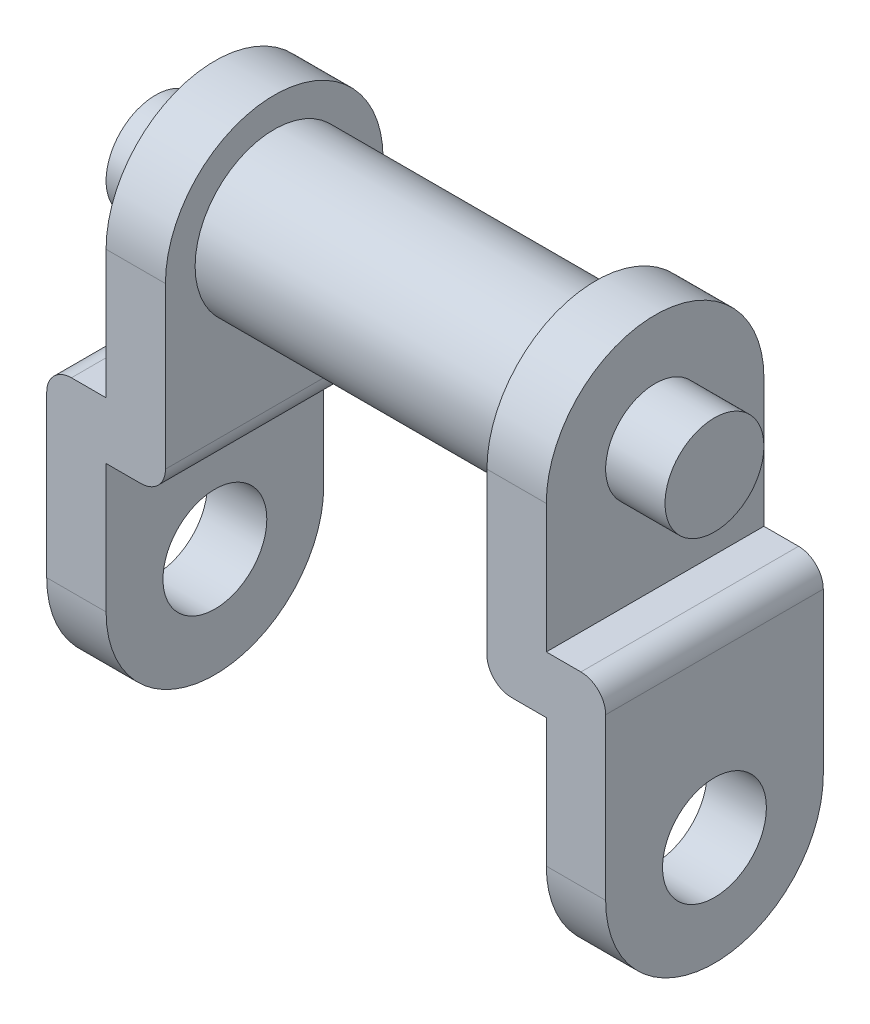
ISO-10303-21;
HEADER;
FILE_DESCRIPTION(('STEP AP214'),'2;1');
FILE_NAME('part.step','',(''),(''),'','','');
FILE_SCHEMA(('AUTOMOTIVE_DESIGN { 1 0 10303 214 1 1 1 1 }'));
ENDSEC;
DATA;
#1=APPLICATION_CONTEXT('core data for automotive mechanical design processes');
#2=APPLICATION_PROTOCOL_DEFINITION('international standard','automotive_design',2000,#1);
#3=PRODUCT_CONTEXT('',#1,'mechanical');
#4=PRODUCT('Part','Part','',(#3));
#5=PRODUCT_RELATED_PRODUCT_CATEGORY('part','',(#4));
#6=PRODUCT_DEFINITION_FORMATION('','',#4);
#7=PRODUCT_DEFINITION_CONTEXT('part definition',#1,'design');
#8=PRODUCT_DEFINITION('design','',#6,#7);
#9=PRODUCT_DEFINITION_SHAPE('','',#8);
#10=(LENGTH_UNIT() NAMED_UNIT(*) SI_UNIT(.MILLI.,.METRE.));
#11=(NAMED_UNIT(*) PLANE_ANGLE_UNIT() SI_UNIT($,.RADIAN.));
#12=(NAMED_UNIT(*) SI_UNIT($,.STERADIAN.) SOLID_ANGLE_UNIT());
#13=UNCERTAINTY_MEASURE_WITH_UNIT(LENGTH_MEASURE(1.E-05),#10,'distance_accuracy_value','');
#14=(GEOMETRIC_REPRESENTATION_CONTEXT(3) GLOBAL_UNCERTAINTY_ASSIGNED_CONTEXT((#13)) GLOBAL_UNIT_ASSIGNED_CONTEXT((#10,
#11,#12)) REPRESENTATION_CONTEXT('',''));
#15=CARTESIAN_POINT('',(0.,0.,0.));
#16=DIRECTION('',(0.,0.,1.));
#17=DIRECTION('',(1.,0.,0.));
#18=AXIS2_PLACEMENT_3D('',#15,#16,#17);
#19=CARTESIAN_POINT('',(4.45,-3.175,2.2));
#20=DIRECTION('',(0.,0.,1.));
#21=DIRECTION('',(1.,0.,0.));
#22=AXIS2_PLACEMENT_3D('',#19,#20,#21);
#23=PLANE('',#22);
#24=CARTESIAN_POINT('',(3.75,-3.25,2.2));
#25=DIRECTION('',(0.,0.,-1.));
#26=DIRECTION('',(-0.707106781186547,-0.707106781186548,0.));
#27=AXIS2_PLACEMENT_3D('',#24,#25,#26);
#28=CIRCLE('',#27,0.5);
#29=CARTESIAN_POINT('',(3.75,-3.75,2.2));
#30=VERTEX_POINT('',#29);
#31=CARTESIAN_POINT('',(3.25,-3.25,2.2));
#32=VERTEX_POINT('',#31);
#33=EDGE_CURVE('E274',#30,#32,#28,.T.);
#34=ORIENTED_EDGE('',*,*,#33,.F.);
#35=DIRECTION('',(1.,0.,0.));
#36=VECTOR('',#35,1.);
#37=CARTESIAN_POINT('',(3.75,-3.75,2.2));
#38=LINE('',#37,#36);
#39=CARTESIAN_POINT('',(4.45,-3.75,2.2));
#40=VERTEX_POINT('',#39);
#41=EDGE_CURVE('E272',#30,#40,#38,.T.);
#42=ORIENTED_EDGE('',*,*,#41,.T.);
#43=DIRECTION('',(0.,-1.,0.));
#44=VECTOR('',#43,1.);
#45=CARTESIAN_POINT('',(4.45,-3.75,2.2));
#46=LINE('',#45,#44);
#47=CARTESIAN_POINT('',(4.45,-6.35,2.2));
#48=VERTEX_POINT('',#47);
#49=EDGE_CURVE('E302',#40,#48,#46,.T.);
#50=ORIENTED_EDGE('',*,*,#49,.T.);
#51=DIRECTION('',(1.,0.,0.));
#52=VECTOR('',#51,1.);
#53=CARTESIAN_POINT('',(4.45,-6.35,2.2));
#54=LINE('',#53,#52);
#55=CARTESIAN_POINT('',(5.65,-6.35,2.2));
#56=VERTEX_POINT('',#55);
#57=EDGE_CURVE('E362',#48,#56,#54,.T.);
#58=ORIENTED_EDGE('',*,*,#57,.T.);
#59=DIRECTION('',(0.,1.,0.));
#60=VECTOR('',#59,1.);
#61=CARTESIAN_POINT('',(5.65,-6.35,2.2));
#62=LINE('',#61,#60);
#63=CARTESIAN_POINT('',(5.65,-3.1,2.2));
#64=VERTEX_POINT('',#63);
#65=EDGE_CURVE('E248',#56,#64,#62,.T.);
#66=ORIENTED_EDGE('',*,*,#65,.T.);
#67=CARTESIAN_POINT('',(5.15,-3.1,2.2));
#68=DIRECTION('',(0.,0.,-1.));
#69=DIRECTION('',(0.707106781186548,0.707106781186548,0.));
#70=AXIS2_PLACEMENT_3D('',#67,#68,#69);
#71=CIRCLE('',#70,0.5);
#72=CARTESIAN_POINT('',(5.15,-2.6,2.2));
#73=VERTEX_POINT('',#72);
#74=EDGE_CURVE('E318',#73,#64,#71,.T.);
#75=ORIENTED_EDGE('',*,*,#74,.F.);
#76=DIRECTION('',(-1.,0.,0.));
#77=VECTOR('',#76,1.);
#78=CARTESIAN_POINT('',(5.15,-2.6,2.2));
#79=LINE('',#78,#77);
#80=CARTESIAN_POINT('',(4.45,-2.6,2.2));
#81=VERTEX_POINT('',#80);
#82=EDGE_CURVE('E30',#73,#81,#79,.T.);
#83=ORIENTED_EDGE('',*,*,#82,.T.);
#84=DIRECTION('',(0.,1.,0.));
#85=VECTOR('',#84,1.);
#86=CARTESIAN_POINT('',(4.45,-2.6,2.2));
#87=LINE('',#86,#85);
#88=CARTESIAN_POINT('',(4.45,0.,2.2));
#89=VERTEX_POINT('',#88);
#90=EDGE_CURVE('E284',#81,#89,#87,.T.);
#91=ORIENTED_EDGE('',*,*,#90,.T.);
#92=DIRECTION('',(1.,0.,0.));
#93=VECTOR('',#92,1.);
#94=CARTESIAN_POINT('',(3.25,0.,2.2));
#95=LINE('',#94,#93);
#96=CARTESIAN_POINT('',(3.25,0.,2.2));
#97=VERTEX_POINT('',#96);
#98=EDGE_CURVE('E419',#97,#89,#95,.T.);
#99=ORIENTED_EDGE('',*,*,#98,.F.);
#100=DIRECTION('',(0.,-1.,0.));
#101=VECTOR('',#100,1.);
#102=CARTESIAN_POINT('',(3.25,0.,2.2));
#103=LINE('',#102,#101);
#104=EDGE_CURVE('E10',#97,#32,#103,.T.);
#105=ORIENTED_EDGE('',*,*,#104,.T.);
#106=EDGE_LOOP('',(#34,#42,#50,#58,#66,#75,#83,#91,#99,#105));
#107=FACE_BOUND('',#106,.T.);
#108=ADVANCED_FACE('F16',(#107),#23,.T.);
#109=CARTESIAN_POINT('',(3.25,2.2,0.));
#110=DIRECTION('',(-1.,0.,0.));
#111=DIRECTION('',(0.,0.,1.));
#112=AXIS2_PLACEMENT_3D('',#109,#110,#111);
#113=PLANE('',#112);
#114=CARTESIAN_POINT('',(3.25,0.,0.));
#115=DIRECTION('',(1.,0.,0.));
#116=DIRECTION('',(0.,0.,-1.));
#117=AXIS2_PLACEMENT_3D('',#114,#115,#116);
#118=CIRCLE('',#117,1.6);
#119=CARTESIAN_POINT('',(3.25,0.,1.6));
#120=VERTEX_POINT('',#119);
#121=EDGE_CURVE('E268',#120,#120,#118,.T.);
#122=ORIENTED_EDGE('',*,*,#121,.T.);
#123=EDGE_LOOP('',(#122));
#124=FACE_BOUND('',#123,.T.);
#125=DIRECTION('',(0.,0.,-1.));
#126=VECTOR('',#125,1.);
#127=CARTESIAN_POINT('',(3.25,-3.25,2.2));
#128=LINE('',#127,#126);
#129=CARTESIAN_POINT('',(3.25,-3.25,-2.2));
#130=VERTEX_POINT('',#129);
#131=EDGE_CURVE('E276',#32,#130,#128,.T.);
#132=ORIENTED_EDGE('',*,*,#131,.F.);
#133=ORIENTED_EDGE('',*,*,#104,.F.);
#134=CARTESIAN_POINT('',(3.25,0.,0.));
#135=DIRECTION('',(-1.,0.,0.));
#136=DIRECTION('',(0.,0.,-1.));
#137=AXIS2_PLACEMENT_3D('',#134,#135,#136);
#138=CIRCLE('',#137,2.2);
#139=CARTESIAN_POINT('',(3.25,0.,-2.2));
#140=VERTEX_POINT('',#139);
#141=EDGE_CURVE('E392',#97,#140,#138,.T.);
#142=ORIENTED_EDGE('',*,*,#141,.T.);
#143=DIRECTION('',(0.,1.,0.));
#144=VECTOR('',#143,1.);
#145=CARTESIAN_POINT('',(3.25,-3.25,-2.2));
#146=LINE('',#145,#144);
#147=EDGE_CURVE('E427',#130,#140,#146,.T.);
#148=ORIENTED_EDGE('',*,*,#147,.F.);
#149=EDGE_LOOP('',(#132,#133,#142,#148));
#150=FACE_BOUND('',#149,.T.);
#151=ADVANCED_FACE('F512',(#124,#150),#113,.T.);
#152=CARTESIAN_POINT('',(5.65,-2.6,0.));
#153=DIRECTION('',(0.,1.,0.));
#154=DIRECTION('',(1.,0.,0.));
#155=AXIS2_PLACEMENT_3D('',#152,#153,#154);
#156=PLANE('',#155);
#157=DIRECTION('',(0.,0.,1.));
#158=VECTOR('',#157,1.);
#159=CARTESIAN_POINT('',(5.15,-2.6,-2.2));
#160=LINE('',#159,#158);
#161=CARTESIAN_POINT('',(5.15,-2.6,-2.2));
#162=VERTEX_POINT('',#161);
#163=EDGE_CURVE('E413',#162,#73,#160,.T.);
#164=ORIENTED_EDGE('',*,*,#163,.F.);
#165=DIRECTION('',(1.,0.,0.));
#166=VECTOR('',#165,1.);
#167=CARTESIAN_POINT('',(4.45,-2.6,-2.2));
#168=LINE('',#167,#166);
#169=CARTESIAN_POINT('',(4.45,-2.6,-2.2));
#170=VERTEX_POINT('',#169);
#171=EDGE_CURVE('E329',#170,#162,#168,.T.);
#172=ORIENTED_EDGE('',*,*,#171,.F.);
#173=DIRECTION('',(0.,0.,1.));
#174=VECTOR('',#173,1.);
#175=CARTESIAN_POINT('',(4.45,-2.6,-2.2));
#176=LINE('',#175,#174);
#177=EDGE_CURVE('E286',#170,#81,#176,.T.);
#178=ORIENTED_EDGE('',*,*,#177,.T.);
#179=ORIENTED_EDGE('',*,*,#82,.F.);
#180=EDGE_LOOP('',(#164,#172,#178,#179));
#181=FACE_BOUND('',#180,.T.);
#182=ADVANCED_FACE('F497',(#181),#156,.T.);
#183=CARTESIAN_POINT('',(4.45,-3.75,0.));
#184=DIRECTION('',(-1.,0.,0.));
#185=DIRECTION('',(0.,0.,1.));
#186=AXIS2_PLACEMENT_3D('',#183,#184,#185);
#187=PLANE('',#186);
#188=CARTESIAN_POINT('',(4.45,-6.35,0.));
#189=DIRECTION('',(1.,0.,0.));
#190=DIRECTION('',(0.,0.,1.));
#191=AXIS2_PLACEMENT_3D('',#188,#189,#190);
#192=CIRCLE('',#191,1.05);
#193=CARTESIAN_POINT('',(4.45,-6.35,-1.05));
#194=VERTEX_POINT('',#193);
#195=EDGE_CURVE('E368',#194,#194,#192,.T.);
#196=ORIENTED_EDGE('',*,*,#195,.T.);
#197=EDGE_LOOP('',(#196));
#198=FACE_BOUND('',#197,.T.);
#199=CARTESIAN_POINT('',(4.45,-6.35,0.));
#200=DIRECTION('',(-1.,0.,0.));
#201=DIRECTION('',(0.,0.,1.));
#202=AXIS2_PLACEMENT_3D('',#199,#200,#201);
#203=CIRCLE('',#202,2.2);
#204=CARTESIAN_POINT('',(4.45,-6.35,-2.2));
#205=VERTEX_POINT('',#204);
#206=EDGE_CURVE('E364',#205,#48,#203,.T.);
#207=ORIENTED_EDGE('',*,*,#206,.T.);
#208=ORIENTED_EDGE('',*,*,#49,.F.);
#209=DIRECTION('',(0.,0.,1.));
#210=VECTOR('',#209,1.);
#211=CARTESIAN_POINT('',(4.45,-3.75,-2.2));
#212=LINE('',#211,#210);
#213=CARTESIAN_POINT('',(4.45,-3.75,-2.2));
#214=VERTEX_POINT('',#213);
#215=EDGE_CURVE('E267',#214,#40,#212,.T.);
#216=ORIENTED_EDGE('',*,*,#215,.F.);
#217=DIRECTION('',(0.,1.,0.));
#218=VECTOR('',#217,1.);
#219=CARTESIAN_POINT('',(4.45,-6.35,-2.2));
#220=LINE('',#219,#218);
#221=EDGE_CURVE('E316',#205,#214,#220,.T.);
#222=ORIENTED_EDGE('',*,*,#221,.F.);
#223=EDGE_LOOP('',(#207,#208,#216,#222));
#224=FACE_BOUND('',#223,.T.);
#225=ADVANCED_FACE('F638',(#198,#224),#187,.T.);
#226=CARTESIAN_POINT('',(4.45,-2.6,0.));
#227=DIRECTION('',(1.,0.,0.));
#228=DIRECTION('',(0.,1.,0.));
#229=AXIS2_PLACEMENT_3D('',#226,#227,#228);
#230=PLANE('',#229);
#231=CARTESIAN_POINT('',(4.45,0.,0.));
#232=DIRECTION('',(-1.,0.,0.));
#233=DIRECTION('',(0.,0.,1.));
#234=AXIS2_PLACEMENT_3D('',#231,#232,#233);
#235=CIRCLE('',#234,1.);
#236=CARTESIAN_POINT('',(4.45,0.,-1.));
#237=VERTEX_POINT('',#236);
#238=EDGE_CURVE('E270',#237,#237,#235,.T.);
#239=ORIENTED_EDGE('',*,*,#238,.T.);
#240=EDGE_LOOP('',(#239));
#241=FACE_BOUND('',#240,.T.);
#242=CARTESIAN_POINT('',(4.45,0.,0.));
#243=DIRECTION('',(1.,0.,0.));
#244=DIRECTION('',(0.,0.,-1.));
#245=AXIS2_PLACEMENT_3D('',#242,#243,#244);
#246=CIRCLE('',#245,2.2);
#247=CARTESIAN_POINT('',(4.45,0.,-2.2));
#248=VERTEX_POINT('',#247);
#249=EDGE_CURVE('E290',#248,#89,#246,.T.);
#250=ORIENTED_EDGE('',*,*,#249,.T.);
#251=ORIENTED_EDGE('',*,*,#90,.F.);
#252=ORIENTED_EDGE('',*,*,#177,.F.);
#253=DIRECTION('',(0.,-1.,0.));
#254=VECTOR('',#253,1.);
#255=CARTESIAN_POINT('',(4.45,0.,-2.2));
#256=LINE('',#255,#254);
#257=EDGE_CURVE('E326',#248,#170,#256,.T.);
#258=ORIENTED_EDGE('',*,*,#257,.F.);
#259=EDGE_LOOP('',(#250,#251,#252,#258));
#260=FACE_BOUND('',#259,.T.);
#261=ADVANCED_FACE('F522',(#241,#260),#230,.T.);
#262=CARTESIAN_POINT('',(5.65,0.,0.));
#263=DIRECTION('',(-1.,0.,0.));
#264=DIRECTION('',(0.,0.,-1.));
#265=AXIS2_PLACEMENT_3D('',#262,#263,#264);
#266=CYLINDRICAL_SURFACE('',#265,2.2);
#267=ORIENTED_EDGE('',*,*,#141,.F.);
#268=ORIENTED_EDGE('',*,*,#98,.T.);
#269=ORIENTED_EDGE('',*,*,#249,.F.);
#270=DIRECTION('',(1.,0.,0.));
#271=VECTOR('',#270,1.);
#272=CARTESIAN_POINT('',(3.25,0.,-2.2));
#273=LINE('',#272,#271);
#274=EDGE_CURVE('E332',#140,#248,#273,.T.);
#275=ORIENTED_EDGE('',*,*,#274,.F.);
#276=EDGE_LOOP('',(#267,#268,#269,#275));
#277=FACE_BOUND('',#276,.T.);
#278=ADVANCED_FACE('F518',(#277),#266,.T.);
#279=CARTESIAN_POINT('',(5.65,-6.35,0.));
#280=DIRECTION('',(-1.,0.,0.));
#281=DIRECTION('',(0.,0.,1.));
#282=AXIS2_PLACEMENT_3D('',#279,#280,#281);
#283=CYLINDRICAL_SURFACE('',#282,2.2);
#284=CARTESIAN_POINT('',(5.65,-6.35,0.));
#285=DIRECTION('',(1.,0.,0.));
#286=DIRECTION('',(0.,0.,1.));
#287=AXIS2_PLACEMENT_3D('',#284,#285,#286);
#288=CIRCLE('',#287,2.2);
#289=CARTESIAN_POINT('',(5.65,-6.35,-2.2));
#290=VERTEX_POINT('',#289);
#291=EDGE_CURVE('E399',#56,#290,#288,.T.);
#292=ORIENTED_EDGE('',*,*,#291,.F.);
#293=ORIENTED_EDGE('',*,*,#57,.F.);
#294=ORIENTED_EDGE('',*,*,#206,.F.);
#295=DIRECTION('',(1.,0.,0.));
#296=VECTOR('',#295,1.);
#297=CARTESIAN_POINT('',(4.45,-6.35,-2.2));
#298=LINE('',#297,#296);
#299=EDGE_CURVE('E254',#205,#290,#298,.T.);
#300=ORIENTED_EDGE('',*,*,#299,.T.);
#301=EDGE_LOOP('',(#292,#293,#294,#300));
#302=FACE_BOUND('',#301,.T.);
#303=ADVANCED_FACE('F598',(#302),#283,.T.);
#304=CARTESIAN_POINT('',(5.65,-6.35,0.));
#305=DIRECTION('',(-1.,0.,0.));
#306=DIRECTION('',(0.,0.,1.));
#307=AXIS2_PLACEMENT_3D('',#304,#305,#306);
#308=CYLINDRICAL_SURFACE('',#307,1.05);
#309=CARTESIAN_POINT('',(5.65,-6.35,0.));
#310=DIRECTION('',(-1.,0.,0.));
#311=DIRECTION('',(0.,0.,1.));
#312=AXIS2_PLACEMENT_3D('',#309,#310,#311);
#313=CIRCLE('',#312,1.05);
#314=CARTESIAN_POINT('',(5.65,-6.35,-1.05));
#315=VERTEX_POINT('',#314);
#316=EDGE_CURVE('E398',#315,#315,#313,.T.);
#317=ORIENTED_EDGE('',*,*,#316,.F.);
#318=EDGE_LOOP('',(#317));
#319=FACE_BOUND('',#318,.T.);
#320=ORIENTED_EDGE('',*,*,#195,.F.);
#321=EDGE_LOOP('',(#320));
#322=FACE_BOUND('',#321,.T.);
#323=ADVANCED_FACE('F601',(#319,#322),#308,.F.);
#324=CARTESIAN_POINT('',(5.65,-8.55,0.));
#325=DIRECTION('',(1.,0.,0.));
#326=DIRECTION('',(0.,1.,0.));
#327=AXIS2_PLACEMENT_3D('',#324,#325,#326);
#328=PLANE('',#327);
#329=ORIENTED_EDGE('',*,*,#316,.T.);
#330=EDGE_LOOP('',(#329));
#331=FACE_BOUND('',#330,.T.);
#332=DIRECTION('',(0.,0.,-1.));
#333=VECTOR('',#332,1.);
#334=CARTESIAN_POINT('',(5.65,-3.1,2.2));
#335=LINE('',#334,#333);
#336=CARTESIAN_POINT('',(5.65,-3.1,-2.2));
#337=VERTEX_POINT('',#336);
#338=EDGE_CURVE('E384',#64,#337,#335,.T.);
#339=ORIENTED_EDGE('',*,*,#338,.F.);
#340=ORIENTED_EDGE('',*,*,#65,.F.);
#341=ORIENTED_EDGE('',*,*,#291,.T.);
#342=DIRECTION('',(0.,-1.,0.));
#343=VECTOR('',#342,1.);
#344=CARTESIAN_POINT('',(5.65,-3.1,-2.2));
#345=LINE('',#344,#343);
#346=EDGE_CURVE('E252',#337,#290,#345,.T.);
#347=ORIENTED_EDGE('',*,*,#346,.F.);
#348=EDGE_LOOP('',(#339,#340,#341,#347));
#349=FACE_BOUND('',#348,.T.);
#350=ADVANCED_FACE('F675',(#331,#349),#328,.T.);
#351=CARTESIAN_POINT('',(5.15,-3.1,0.));
#352=DIRECTION('',(0.,0.,1.));
#353=DIRECTION('',(0.707106781186548,0.707106781186548,0.));
#354=AXIS2_PLACEMENT_3D('',#351,#352,#353);
#355=CYLINDRICAL_SURFACE('',#354,0.5);
#356=ORIENTED_EDGE('',*,*,#74,.T.);
#357=ORIENTED_EDGE('',*,*,#338,.T.);
#358=CARTESIAN_POINT('',(5.15,-3.1,-2.2));
#359=DIRECTION('',(0.,0.,1.));
#360=DIRECTION('',(0.707106781186548,0.707106781186548,0.));
#361=AXIS2_PLACEMENT_3D('',#358,#359,#360);
#362=CIRCLE('',#361,0.5);
#363=EDGE_CURVE('E258',#337,#162,#362,.T.);
#364=ORIENTED_EDGE('',*,*,#363,.T.);
#365=ORIENTED_EDGE('',*,*,#163,.T.);
#366=EDGE_LOOP('',(#356,#357,#364,#365));
#367=FACE_BOUND('',#366,.T.);
#368=ADVANCED_FACE('F489',(#367),#355,.T.);
#369=CARTESIAN_POINT('',(4.45,-3.175,-2.2));
#370=DIRECTION('',(0.,0.,1.));
#371=DIRECTION('',(1.,0.,0.));
#372=AXIS2_PLACEMENT_3D('',#369,#370,#371);
#373=PLANE('',#372);
#374=CARTESIAN_POINT('',(3.75,-3.25,-2.2));
#375=DIRECTION('',(0.,0.,1.));
#376=DIRECTION('',(-0.707106781186547,-0.707106781186548,0.));
#377=AXIS2_PLACEMENT_3D('',#374,#375,#376);
#378=CIRCLE('',#377,0.5);
#379=CARTESIAN_POINT('',(3.75,-3.75,-2.2));
#380=VERTEX_POINT('',#379);
#381=EDGE_CURVE('E312',#130,#380,#378,.T.);
#382=ORIENTED_EDGE('',*,*,#381,.F.);
#383=ORIENTED_EDGE('',*,*,#147,.T.);
#384=ORIENTED_EDGE('',*,*,#274,.T.);
#385=ORIENTED_EDGE('',*,*,#257,.T.);
#386=ORIENTED_EDGE('',*,*,#171,.T.);
#387=ORIENTED_EDGE('',*,*,#363,.F.);
#388=ORIENTED_EDGE('',*,*,#346,.T.);
#389=ORIENTED_EDGE('',*,*,#299,.F.);
#390=ORIENTED_EDGE('',*,*,#221,.T.);
#391=DIRECTION('',(-1.,0.,0.));
#392=VECTOR('',#391,1.);
#393=CARTESIAN_POINT('',(4.45,-3.75,-2.2));
#394=LINE('',#393,#392);
#395=EDGE_CURVE('E273',#214,#380,#394,.T.);
#396=ORIENTED_EDGE('',*,*,#395,.T.);
#397=EDGE_LOOP('',(#382,#383,#384,#385,#386,#387,#388,#389,#390,#396));
#398=FACE_BOUND('',#397,.T.);
#399=ADVANCED_FACE('F18',(#398),#373,.F.);
#400=CARTESIAN_POINT('',(3.25,-3.75,0.));
#401=DIRECTION('',(0.,-1.,0.));
#402=DIRECTION('',(0.,0.,-1.));
#403=AXIS2_PLACEMENT_3D('',#400,#401,#402);
#404=PLANE('',#403);
#405=DIRECTION('',(0.,0.,1.));
#406=VECTOR('',#405,1.);
#407=CARTESIAN_POINT('',(3.75,-3.75,-2.2));
#408=LINE('',#407,#406);
#409=EDGE_CURVE('E331',#380,#30,#408,.T.);
#410=ORIENTED_EDGE('',*,*,#409,.F.);
#411=ORIENTED_EDGE('',*,*,#395,.F.);
#412=ORIENTED_EDGE('',*,*,#215,.T.);
#413=ORIENTED_EDGE('',*,*,#41,.F.);
#414=EDGE_LOOP('',(#410,#411,#412,#413));
#415=FACE_BOUND('',#414,.T.);
#416=ADVANCED_FACE('F572',(#415),#404,.T.);
#417=CARTESIAN_POINT('',(3.75,-3.25,0.));
#418=DIRECTION('',(0.,0.,1.));
#419=DIRECTION('',(-0.707106781186547,-0.707106781186548,0.));
#420=AXIS2_PLACEMENT_3D('',#417,#418,#419);
#421=CYLINDRICAL_SURFACE('',#420,0.5);
#422=ORIENTED_EDGE('',*,*,#33,.T.);
#423=ORIENTED_EDGE('',*,*,#131,.T.);
#424=ORIENTED_EDGE('',*,*,#381,.T.);
#425=ORIENTED_EDGE('',*,*,#409,.T.);
#426=EDGE_LOOP('',(#422,#423,#424,#425));
#427=FACE_BOUND('',#426,.T.);
#428=ADVANCED_FACE('F569',(#427),#421,.T.);
#429=CARTESIAN_POINT('',(5.65,0.,0.));
#430=DIRECTION('',(1.,0.,0.));
#431=DIRECTION('',(0.,1.,0.));
#432=AXIS2_PLACEMENT_3D('',#429,#430,#431);
#433=PLANE('',#432);
#434=CARTESIAN_POINT('',(5.65,0.,0.));
#435=DIRECTION('',(-1.,0.,0.));
#436=DIRECTION('',(0.,0.,1.));
#437=AXIS2_PLACEMENT_3D('',#434,#435,#436);
#438=CIRCLE('',#437,1.);
#439=CARTESIAN_POINT('',(5.65,0.,-1.));
#440=VERTEX_POINT('',#439);
#441=EDGE_CURVE('E263',#440,#440,#438,.T.);
#442=ORIENTED_EDGE('',*,*,#441,.F.);
#443=EDGE_LOOP('',(#442));
#444=FACE_BOUND('',#443,.T.);
#445=ADVANCED_FACE('F575',(#444),#433,.T.);
#446=CARTESIAN_POINT('',(4.45,0.,0.));
#447=DIRECTION('',(1.,0.,0.));
#448=DIRECTION('',(0.,0.,1.));
#449=AXIS2_PLACEMENT_3D('',#446,#447,#448);
#450=CYLINDRICAL_SURFACE('',#449,1.);
#451=ORIENTED_EDGE('',*,*,#238,.F.);
#452=EDGE_LOOP('',(#451));
#453=FACE_BOUND('',#452,.T.);
#454=ORIENTED_EDGE('',*,*,#441,.T.);
#455=EDGE_LOOP('',(#454));
#456=FACE_BOUND('',#455,.T.);
#457=ADVANCED_FACE('F578',(#453,#456),#450,.T.);
#458=CARTESIAN_POINT('',(3.25,0.,0.));
#459=DIRECTION('',(-1.,0.,0.));
#460=DIRECTION('',(0.,0.,-1.));
#461=AXIS2_PLACEMENT_3D('',#458,#459,#460);
#462=CYLINDRICAL_SURFACE('',#461,1.6);
#463=ORIENTED_EDGE('',*,*,#121,.F.);
#464=EDGE_LOOP('',(#463));
#465=FACE_BOUND('',#464,.T.);
#466=CARTESIAN_POINT('',(-3.25,0.,0.));
#467=DIRECTION('',(-1.,0.,0.));
#468=DIRECTION('',(0.,0.,-1.));
#469=AXIS2_PLACEMENT_3D('',#466,#467,#468);
#470=CIRCLE('',#469,1.6);
#471=CARTESIAN_POINT('',(-3.25,0.,1.6));
#472=VERTEX_POINT('',#471);
#473=EDGE_CURVE('E295',#472,#472,#470,.T.);
#474=ORIENTED_EDGE('',*,*,#473,.F.);
#475=EDGE_LOOP('',(#474));
#476=FACE_BOUND('',#475,.T.);
#477=ADVANCED_FACE('F713',(#465,#476),#462,.T.);
#478=CARTESIAN_POINT('',(-3.25,-3.75,0.));
#479=DIRECTION('',(0.,1.,0.));
#480=DIRECTION('',(1.,0.,0.));
#481=AXIS2_PLACEMENT_3D('',#478,#479,#480);
#482=PLANE('',#481);
#483=DIRECTION('',(0.,0.,-1.));
#484=VECTOR('',#483,1.);
#485=CARTESIAN_POINT('',(-3.75,-3.75,2.2));
#486=LINE('',#485,#484);
#487=CARTESIAN_POINT('',(-3.75,-3.75,2.2));
#488=VERTEX_POINT('',#487);
#489=CARTESIAN_POINT('',(-3.75,-3.75,-2.2));
#490=VERTEX_POINT('',#489);
#491=EDGE_CURVE('E463',#488,#490,#486,.T.);
#492=ORIENTED_EDGE('',*,*,#491,.F.);
#493=DIRECTION('',(-1.,0.,0.));
#494=VECTOR('',#493,1.);
#495=CARTESIAN_POINT('',(-3.75,-3.75,2.2));
#496=LINE('',#495,#494);
#497=CARTESIAN_POINT('',(-4.45,-3.75,2.2));
#498=VERTEX_POINT('',#497);
#499=EDGE_CURVE('E282',#488,#498,#496,.T.);
#500=ORIENTED_EDGE('',*,*,#499,.T.);
#501=DIRECTION('',(0.,0.,1.));
#502=VECTOR('',#501,1.);
#503=CARTESIAN_POINT('',(-4.45,-3.75,-2.2));
#504=LINE('',#503,#502);
#505=CARTESIAN_POINT('',(-4.45,-3.75,-2.2));
#506=VERTEX_POINT('',#505);
#507=EDGE_CURVE('E313',#506,#498,#504,.T.);
#508=ORIENTED_EDGE('',*,*,#507,.F.);
#509=DIRECTION('',(1.,0.,0.));
#510=VECTOR('',#509,1.);
#511=CARTESIAN_POINT('',(-4.45,-3.75,-2.2));
#512=LINE('',#511,#510);
#513=EDGE_CURVE('E395',#506,#490,#512,.T.);
#514=ORIENTED_EDGE('',*,*,#513,.T.);
#515=EDGE_LOOP('',(#492,#500,#508,#514));
#516=FACE_BOUND('',#515,.T.);
#517=ADVANCED_FACE('F465',(#516),#482,.F.);
#518=CARTESIAN_POINT('',(-5.65,-2.6,0.));
#519=DIRECTION('',(0.,-1.,0.));
#520=DIRECTION('',(0.,0.,-1.));
#521=AXIS2_PLACEMENT_3D('',#518,#519,#520);
#522=PLANE('',#521);
#523=DIRECTION('',(0.,0.,-1.));
#524=VECTOR('',#523,1.);
#525=CARTESIAN_POINT('',(-5.15,-2.6,2.2));
#526=LINE('',#525,#524);
#527=CARTESIAN_POINT('',(-5.15,-2.6,2.2));
#528=VERTEX_POINT('',#527);
#529=CARTESIAN_POINT('',(-5.15,-2.6,-2.2));
#530=VERTEX_POINT('',#529);
#531=EDGE_CURVE('E305',#528,#530,#526,.T.);
#532=ORIENTED_EDGE('',*,*,#531,.F.);
#533=DIRECTION('',(1.,0.,0.));
#534=VECTOR('',#533,1.);
#535=CARTESIAN_POINT('',(-5.15,-2.6,2.2));
#536=LINE('',#535,#534);
#537=CARTESIAN_POINT('',(-4.45,-2.6,2.2));
#538=VERTEX_POINT('',#537);
#539=EDGE_CURVE('E260',#528,#538,#536,.T.);
#540=ORIENTED_EDGE('',*,*,#539,.T.);
#541=DIRECTION('',(0.,0.,1.));
#542=VECTOR('',#541,1.);
#543=CARTESIAN_POINT('',(-4.45,-2.6,-2.2));
#544=LINE('',#543,#542);
#545=CARTESIAN_POINT('',(-4.45,-2.6,-2.2));
#546=VERTEX_POINT('',#545);
#547=EDGE_CURVE('E371',#546,#538,#544,.T.);
#548=ORIENTED_EDGE('',*,*,#547,.F.);
#549=DIRECTION('',(-1.,0.,0.));
#550=VECTOR('',#549,1.);
#551=CARTESIAN_POINT('',(-4.45,-2.6,-2.2));
#552=LINE('',#551,#550);
#553=EDGE_CURVE('E322',#546,#530,#552,.T.);
#554=ORIENTED_EDGE('',*,*,#553,.T.);
#555=EDGE_LOOP('',(#532,#540,#548,#554));
#556=FACE_BOUND('',#555,.T.);
#557=ADVANCED_FACE('F607',(#556),#522,.F.);
#558=CARTESIAN_POINT('',(-4.45,-2.6,0.));
#559=DIRECTION('',(1.,0.,0.));
#560=DIRECTION('',(0.,1.,0.));
#561=AXIS2_PLACEMENT_3D('',#558,#559,#560);
#562=PLANE('',#561);
#563=CARTESIAN_POINT('',(-4.45,0.,0.));
#564=DIRECTION('',(1.,0.,0.));
#565=DIRECTION('',(0.,0.,1.));
#566=AXIS2_PLACEMENT_3D('',#563,#564,#565);
#567=CIRCLE('',#566,1.);
#568=CARTESIAN_POINT('',(-4.45,0.,-1.));
#569=VERTEX_POINT('',#568);
#570=EDGE_CURVE('E435',#569,#569,#567,.T.);
#571=ORIENTED_EDGE('',*,*,#570,.T.);
#572=EDGE_LOOP('',(#571));
#573=FACE_BOUND('',#572,.T.);
#574=CARTESIAN_POINT('',(-4.45,0.,0.));
#575=DIRECTION('',(-1.,0.,0.));
#576=DIRECTION('',(0.,0.,-1.));
#577=AXIS2_PLACEMENT_3D('',#574,#575,#576);
#578=CIRCLE('',#577,2.2);
#579=CARTESIAN_POINT('',(-4.45,0.,2.2));
#580=VERTEX_POINT('',#579);
#581=CARTESIAN_POINT('',(-4.45,0.,-2.2));
#582=VERTEX_POINT('',#581);
#583=EDGE_CURVE('E242',#580,#582,#578,.T.);
#584=ORIENTED_EDGE('',*,*,#583,.T.);
#585=DIRECTION('',(0.,-1.,0.));
#586=VECTOR('',#585,1.);
#587=CARTESIAN_POINT('',(-4.45,0.,-2.2));
#588=LINE('',#587,#586);
#589=EDGE_CURVE('E360',#582,#546,#588,.T.);
#590=ORIENTED_EDGE('',*,*,#589,.T.);
#591=ORIENTED_EDGE('',*,*,#547,.T.);
#592=DIRECTION('',(0.,1.,0.));
#593=VECTOR('',#592,1.);
#594=CARTESIAN_POINT('',(-4.45,-2.6,2.2));
#595=LINE('',#594,#593);
#596=EDGE_CURVE('E265',#538,#580,#595,.T.);
#597=ORIENTED_EDGE('',*,*,#596,.T.);
#598=EDGE_LOOP('',(#584,#590,#591,#597));
#599=FACE_BOUND('',#598,.T.);
#600=ADVANCED_FACE('F602',(#573,#599),#562,.F.);
#601=CARTESIAN_POINT('',(-4.45,-3.75,0.));
#602=DIRECTION('',(-1.,0.,0.));
#603=DIRECTION('',(0.,0.,1.));
#604=AXIS2_PLACEMENT_3D('',#601,#602,#603);
#605=PLANE('',#604);
#606=CARTESIAN_POINT('',(-4.45,-6.35,0.));
#607=DIRECTION('',(-1.,0.,0.));
#608=DIRECTION('',(0.,0.,1.));
#609=AXIS2_PLACEMENT_3D('',#606,#607,#608);
#610=CIRCLE('',#609,1.05);
#611=CARTESIAN_POINT('',(-4.45,-6.35,-1.05));
#612=VERTEX_POINT('',#611);
#613=EDGE_CURVE('E240',#612,#612,#610,.T.);
#614=ORIENTED_EDGE('',*,*,#613,.T.);
#615=EDGE_LOOP('',(#614));
#616=FACE_BOUND('',#615,.T.);
#617=CARTESIAN_POINT('',(-4.45,-6.35,0.));
#618=DIRECTION('',(1.,0.,0.));
#619=DIRECTION('',(0.,0.,1.));
#620=AXIS2_PLACEMENT_3D('',#617,#618,#619);
#621=CIRCLE('',#620,2.2);
#622=CARTESIAN_POINT('',(-4.45,-6.35,2.2));
#623=VERTEX_POINT('',#622);
#624=CARTESIAN_POINT('',(-4.45,-6.35,-2.2));
#625=VERTEX_POINT('',#624);
#626=EDGE_CURVE('E376',#623,#625,#621,.T.);
#627=ORIENTED_EDGE('',*,*,#626,.T.);
#628=DIRECTION('',(0.,1.,0.));
#629=VECTOR('',#628,1.);
#630=CARTESIAN_POINT('',(-4.45,-6.35,-2.2));
#631=LINE('',#630,#629);
#632=EDGE_CURVE('E367',#625,#506,#631,.T.);
#633=ORIENTED_EDGE('',*,*,#632,.T.);
#634=ORIENTED_EDGE('',*,*,#507,.T.);
#635=DIRECTION('',(0.,-1.,0.));
#636=VECTOR('',#635,1.);
#637=CARTESIAN_POINT('',(-4.45,-3.75,2.2));
#638=LINE('',#637,#636);
#639=EDGE_CURVE('E261',#498,#623,#638,.T.);
#640=ORIENTED_EDGE('',*,*,#639,.T.);
#641=EDGE_LOOP('',(#627,#633,#634,#640));
#642=FACE_BOUND('',#641,.T.);
#643=ADVANCED_FACE('F460',(#616,#642),#605,.F.);
#644=CARTESIAN_POINT('',(-4.45,-3.175,2.2));
#645=DIRECTION('',(0.,0.,-1.));
#646=DIRECTION('',(0.,-1.,0.));
#647=AXIS2_PLACEMENT_3D('',#644,#645,#646);
#648=PLANE('',#647);
#649=CARTESIAN_POINT('',(-3.75,-3.25,2.2));
#650=DIRECTION('',(0.,0.,-1.));
#651=DIRECTION('',(0.707106781186548,-0.707106781186548,0.));
#652=AXIS2_PLACEMENT_3D('',#649,#650,#651);
#653=CIRCLE('',#652,0.5);
#654=CARTESIAN_POINT('',(-3.25,-3.25,2.2));
#655=VERTEX_POINT('',#654);
#656=EDGE_CURVE('E436',#655,#488,#653,.T.);
#657=ORIENTED_EDGE('',*,*,#656,.F.);
#658=DIRECTION('',(0.,-1.,0.));
#659=VECTOR('',#658,1.);
#660=CARTESIAN_POINT('',(-3.25,0.,2.2));
#661=LINE('',#660,#659);
#662=CARTESIAN_POINT('',(-3.25,0.,2.2));
#663=VERTEX_POINT('',#662);
#664=EDGE_CURVE('E288',#663,#655,#661,.T.);
#665=ORIENTED_EDGE('',*,*,#664,.F.);
#666=DIRECTION('',(1.,0.,0.));
#667=VECTOR('',#666,1.);
#668=CARTESIAN_POINT('',(-4.45,0.,2.2));
#669=LINE('',#668,#667);
#670=EDGE_CURVE('E97',#580,#663,#669,.T.);
#671=ORIENTED_EDGE('',*,*,#670,.F.);
#672=ORIENTED_EDGE('',*,*,#596,.F.);
#673=ORIENTED_EDGE('',*,*,#539,.F.);
#674=CARTESIAN_POINT('',(-5.15,-3.1,2.2));
#675=DIRECTION('',(0.,0.,-1.));
#676=DIRECTION('',(-0.707106781186548,0.707106781186548,0.));
#677=AXIS2_PLACEMENT_3D('',#674,#675,#676);
#678=CIRCLE('',#677,0.5);
#679=CARTESIAN_POINT('',(-5.65,-3.1,2.2));
#680=VERTEX_POINT('',#679);
#681=EDGE_CURVE('E307',#680,#528,#678,.T.);
#682=ORIENTED_EDGE('',*,*,#681,.F.);
#683=DIRECTION('',(0.,1.,0.));
#684=VECTOR('',#683,1.);
#685=CARTESIAN_POINT('',(-5.65,-6.35,2.2));
#686=LINE('',#685,#684);
#687=CARTESIAN_POINT('',(-5.65,-6.35,2.2));
#688=VERTEX_POINT('',#687);
#689=EDGE_CURVE('E236',#688,#680,#686,.T.);
#690=ORIENTED_EDGE('',*,*,#689,.F.);
#691=DIRECTION('',(1.,0.,0.));
#692=VECTOR('',#691,1.);
#693=CARTESIAN_POINT('',(-5.65,-6.35,2.2));
#694=LINE('',#693,#692);
#695=EDGE_CURVE('E297',#688,#623,#694,.T.);
#696=ORIENTED_EDGE('',*,*,#695,.T.);
#697=ORIENTED_EDGE('',*,*,#639,.F.);
#698=ORIENTED_EDGE('',*,*,#499,.F.);
#699=EDGE_LOOP('',(#657,#665,#671,#672,#673,#682,#690,#696,#697,#698));
#700=FACE_BOUND('',#699,.T.);
#701=ADVANCED_FACE('F469',(#700),#648,.F.);
#702=CARTESIAN_POINT('',(-5.65,-6.35,0.));
#703=DIRECTION('',(-1.,0.,0.));
#704=DIRECTION('',(0.,0.,1.));
#705=AXIS2_PLACEMENT_3D('',#702,#703,#704);
#706=CYLINDRICAL_SURFACE('',#705,2.2);
#707=ORIENTED_EDGE('',*,*,#626,.F.);
#708=ORIENTED_EDGE('',*,*,#695,.F.);
#709=CARTESIAN_POINT('',(-5.65,-6.35,0.));
#710=DIRECTION('',(-1.,0.,0.));
#711=DIRECTION('',(0.,0.,1.));
#712=AXIS2_PLACEMENT_3D('',#709,#710,#711);
#713=CIRCLE('',#712,2.2);
#714=CARTESIAN_POINT('',(-5.65,-6.35,-2.2));
#715=VERTEX_POINT('',#714);
#716=EDGE_CURVE('E247',#715,#688,#713,.T.);
#717=ORIENTED_EDGE('',*,*,#716,.F.);
#718=DIRECTION('',(1.,0.,0.));
#719=VECTOR('',#718,1.);
#720=CARTESIAN_POINT('',(-5.65,-6.35,-2.2));
#721=LINE('',#720,#719);
#722=EDGE_CURVE('E363',#715,#625,#721,.T.);
#723=ORIENTED_EDGE('',*,*,#722,.T.);
#724=EDGE_LOOP('',(#707,#708,#717,#723));
#725=FACE_BOUND('',#724,.T.);
#726=ADVANCED_FACE('F471',(#725),#706,.T.);
#727=CARTESIAN_POINT('',(-5.65,0.,0.));
#728=DIRECTION('',(-1.,0.,0.));
#729=DIRECTION('',(0.,0.,-1.));
#730=AXIS2_PLACEMENT_3D('',#727,#728,#729);
#731=CYLINDRICAL_SURFACE('',#730,2.2);
#732=CARTESIAN_POINT('',(-3.25,0.,0.));
#733=DIRECTION('',(1.,0.,0.));
#734=DIRECTION('',(0.,0.,-1.));
#735=AXIS2_PLACEMENT_3D('',#732,#733,#734);
#736=CIRCLE('',#735,2.2);
#737=CARTESIAN_POINT('',(-3.25,0.,-2.2));
#738=VERTEX_POINT('',#737);
#739=EDGE_CURVE('E291',#738,#663,#736,.T.);
#740=ORIENTED_EDGE('',*,*,#739,.F.);
#741=DIRECTION('',(1.,0.,0.));
#742=VECTOR('',#741,1.);
#743=CARTESIAN_POINT('',(-4.45,0.,-2.2));
#744=LINE('',#743,#742);
#745=EDGE_CURVE('E113',#582,#738,#744,.T.);
#746=ORIENTED_EDGE('',*,*,#745,.F.);
#747=ORIENTED_EDGE('',*,*,#583,.F.);
#748=ORIENTED_EDGE('',*,*,#670,.T.);
#749=EDGE_LOOP('',(#740,#746,#747,#748));
#750=FACE_BOUND('',#749,.T.);
#751=ADVANCED_FACE('F647',(#750),#731,.T.);
#752=CARTESIAN_POINT('',(-5.65,-6.35,0.));
#753=DIRECTION('',(-1.,0.,0.));
#754=DIRECTION('',(0.,0.,1.));
#755=AXIS2_PLACEMENT_3D('',#752,#753,#754);
#756=CYLINDRICAL_SURFACE('',#755,1.05);
#757=CARTESIAN_POINT('',(-5.65,-6.35,0.));
#758=DIRECTION('',(1.,0.,0.));
#759=DIRECTION('',(0.,0.,1.));
#760=AXIS2_PLACEMENT_3D('',#757,#758,#759);
#761=CIRCLE('',#760,1.05);
#762=CARTESIAN_POINT('',(-5.65,-6.35,-1.05));
#763=VERTEX_POINT('',#762);
#764=EDGE_CURVE('E231',#763,#763,#761,.T.);
#765=ORIENTED_EDGE('',*,*,#764,.F.);
#766=EDGE_LOOP('',(#765));
#767=FACE_BOUND('',#766,.T.);
#768=ORIENTED_EDGE('',*,*,#613,.F.);
#769=EDGE_LOOP('',(#768));
#770=FACE_BOUND('',#769,.T.);
#771=ADVANCED_FACE('F617',(#767,#770),#756,.F.);
#772=CARTESIAN_POINT('',(-5.65,-8.55,0.));
#773=DIRECTION('',(1.,0.,0.));
#774=DIRECTION('',(0.,1.,0.));
#775=AXIS2_PLACEMENT_3D('',#772,#773,#774);
#776=PLANE('',#775);
#777=ORIENTED_EDGE('',*,*,#764,.T.);
#778=EDGE_LOOP('',(#777));
#779=FACE_BOUND('',#778,.T.);
#780=DIRECTION('',(0.,0.,1.));
#781=VECTOR('',#780,1.);
#782=CARTESIAN_POINT('',(-5.65,-3.1,-2.2));
#783=LINE('',#782,#781);
#784=CARTESIAN_POINT('',(-5.65,-3.1,-2.2));
#785=VERTEX_POINT('',#784);
#786=EDGE_CURVE('E308',#785,#680,#783,.T.);
#787=ORIENTED_EDGE('',*,*,#786,.F.);
#788=DIRECTION('',(0.,-1.,0.));
#789=VECTOR('',#788,1.);
#790=CARTESIAN_POINT('',(-5.65,-3.1,-2.2));
#791=LINE('',#790,#789);
#792=EDGE_CURVE('E324',#785,#715,#791,.T.);
#793=ORIENTED_EDGE('',*,*,#792,.T.);
#794=ORIENTED_EDGE('',*,*,#716,.T.);
#795=ORIENTED_EDGE('',*,*,#689,.T.);
#796=EDGE_LOOP('',(#787,#793,#794,#795));
#797=FACE_BOUND('',#796,.T.);
#798=ADVANCED_FACE('F235',(#779,#797),#776,.F.);
#799=CARTESIAN_POINT('',(-5.15,-3.1,0.));
#800=DIRECTION('',(0.,0.,1.));
#801=DIRECTION('',(-0.707106781186548,0.707106781186548,0.));
#802=AXIS2_PLACEMENT_3D('',#799,#800,#801);
#803=CYLINDRICAL_SURFACE('',#802,0.5);
#804=ORIENTED_EDGE('',*,*,#681,.T.);
#805=ORIENTED_EDGE('',*,*,#531,.T.);
#806=CARTESIAN_POINT('',(-5.15,-3.1,-2.2));
#807=DIRECTION('',(0.,0.,1.));
#808=DIRECTION('',(-0.707106781186548,0.707106781186548,0.));
#809=AXIS2_PLACEMENT_3D('',#806,#807,#808);
#810=CIRCLE('',#809,0.5);
#811=EDGE_CURVE('E319',#530,#785,#810,.T.);
#812=ORIENTED_EDGE('',*,*,#811,.T.);
#813=ORIENTED_EDGE('',*,*,#786,.T.);
#814=EDGE_LOOP('',(#804,#805,#812,#813));
#815=FACE_BOUND('',#814,.T.);
#816=ADVANCED_FACE('F618',(#815),#803,.T.);
#817=CARTESIAN_POINT('',(-4.45,-3.175,-2.2));
#818=DIRECTION('',(0.,0.,-1.));
#819=DIRECTION('',(0.,-1.,0.));
#820=AXIS2_PLACEMENT_3D('',#817,#818,#819);
#821=PLANE('',#820);
#822=CARTESIAN_POINT('',(-3.75,-3.25,-2.2));
#823=DIRECTION('',(0.,0.,1.));
#824=DIRECTION('',(0.707106781186548,-0.707106781186548,0.));
#825=AXIS2_PLACEMENT_3D('',#822,#823,#824);
#826=CIRCLE('',#825,0.5);
#827=CARTESIAN_POINT('',(-3.25,-3.25,-2.2));
#828=VERTEX_POINT('',#827);
#829=EDGE_CURVE('E451',#490,#828,#826,.T.);
#830=ORIENTED_EDGE('',*,*,#829,.F.);
#831=ORIENTED_EDGE('',*,*,#513,.F.);
#832=ORIENTED_EDGE('',*,*,#632,.F.);
#833=ORIENTED_EDGE('',*,*,#722,.F.);
#834=ORIENTED_EDGE('',*,*,#792,.F.);
#835=ORIENTED_EDGE('',*,*,#811,.F.);
#836=ORIENTED_EDGE('',*,*,#553,.F.);
#837=ORIENTED_EDGE('',*,*,#589,.F.);
#838=ORIENTED_EDGE('',*,*,#745,.T.);
#839=DIRECTION('',(0.,1.,0.));
#840=VECTOR('',#839,1.);
#841=CARTESIAN_POINT('',(-3.25,-3.25,-2.2));
#842=LINE('',#841,#840);
#843=EDGE_CURVE('E450',#828,#738,#842,.T.);
#844=ORIENTED_EDGE('',*,*,#843,.F.);
#845=EDGE_LOOP('',(#830,#831,#832,#833,#834,#835,#836,#837,#838,#844));
#846=FACE_BOUND('',#845,.T.);
#847=ADVANCED_FACE('F480',(#846),#821,.T.);
#848=CARTESIAN_POINT('',(-3.25,2.2,0.));
#849=DIRECTION('',(-1.,0.,0.));
#850=DIRECTION('',(0.,0.,1.));
#851=AXIS2_PLACEMENT_3D('',#848,#849,#850);
#852=PLANE('',#851);
#853=ORIENTED_EDGE('',*,*,#473,.T.);
#854=EDGE_LOOP('',(#853));
#855=FACE_BOUND('',#854,.T.);
#856=DIRECTION('',(0.,0.,1.));
#857=VECTOR('',#856,1.);
#858=CARTESIAN_POINT('',(-3.25,-3.25,-2.2));
#859=LINE('',#858,#857);
#860=EDGE_CURVE('E447',#828,#655,#859,.T.);
#861=ORIENTED_EDGE('',*,*,#860,.F.);
#862=ORIENTED_EDGE('',*,*,#843,.T.);
#863=ORIENTED_EDGE('',*,*,#739,.T.);
#864=ORIENTED_EDGE('',*,*,#664,.T.);
#865=EDGE_LOOP('',(#861,#862,#863,#864));
#866=FACE_BOUND('',#865,.T.);
#867=ADVANCED_FACE('F627',(#855,#866),#852,.F.);
#868=CARTESIAN_POINT('',(-3.75,-3.25,0.));
#869=DIRECTION('',(0.,0.,1.));
#870=DIRECTION('',(0.707106781186548,-0.707106781186548,0.));
#871=AXIS2_PLACEMENT_3D('',#868,#869,#870);
#872=CYLINDRICAL_SURFACE('',#871,0.5);
#873=ORIENTED_EDGE('',*,*,#656,.T.);
#874=ORIENTED_EDGE('',*,*,#491,.T.);
#875=ORIENTED_EDGE('',*,*,#829,.T.);
#876=ORIENTED_EDGE('',*,*,#860,.T.);
#877=EDGE_LOOP('',(#873,#874,#875,#876));
#878=FACE_BOUND('',#877,.T.);
#879=ADVANCED_FACE('F623',(#878),#872,.T.);
#880=CARTESIAN_POINT('',(-5.65,0.,0.));
#881=DIRECTION('',(1.,0.,0.));
#882=DIRECTION('',(0.,1.,0.));
#883=AXIS2_PLACEMENT_3D('',#880,#881,#882);
#884=PLANE('',#883);
#885=CARTESIAN_POINT('',(-5.65,0.,0.));
#886=DIRECTION('',(-1.,0.,0.));
#887=DIRECTION('',(0.,0.,1.));
#888=AXIS2_PLACEMENT_3D('',#885,#886,#887);
#889=CIRCLE('',#888,1.);
#890=CARTESIAN_POINT('',(-5.65,0.,-1.));
#891=VERTEX_POINT('',#890);
#892=EDGE_CURVE('E20',#891,#891,#889,.T.);
#893=ORIENTED_EDGE('',*,*,#892,.T.);
#894=EDGE_LOOP('',(#893));
#895=FACE_BOUND('',#894,.T.);
#896=ADVANCED_FACE('F613',(#895),#884,.F.);
#897=CARTESIAN_POINT('',(-4.45,0.,0.));
#898=DIRECTION('',(1.,0.,0.));
#899=DIRECTION('',(0.,0.,1.));
#900=AXIS2_PLACEMENT_3D('',#897,#898,#899);
#901=CYLINDRICAL_SURFACE('',#900,1.);
#902=ORIENTED_EDGE('',*,*,#570,.F.);
#903=EDGE_LOOP('',(#902));
#904=FACE_BOUND('',#903,.T.);
#905=ORIENTED_EDGE('',*,*,#892,.F.);
#906=EDGE_LOOP('',(#905));
#907=FACE_BOUND('',#906,.T.);
#908=ADVANCED_FACE('F611',(#904,#907),#901,.T.);
#909=CLOSED_SHELL('',(#108,#151,#182,#225,#261,#278,#303,#323,#350,#368,#399,#416,#428,#445,
#457,#477,#517,#557,#600,#643,#701,#726,#751,#771,#798,#816,#847,#867,#879,#896,#908));
#910=MANIFOLD_SOLID_BREP('B1',#909);
#911=ADVANCED_BREP_SHAPE_REPRESENTATION('',(#18,#910),#14);
#912=SHAPE_DEFINITION_REPRESENTATION(#9,#911);
ENDSEC;
END-ISO-10303-21;
